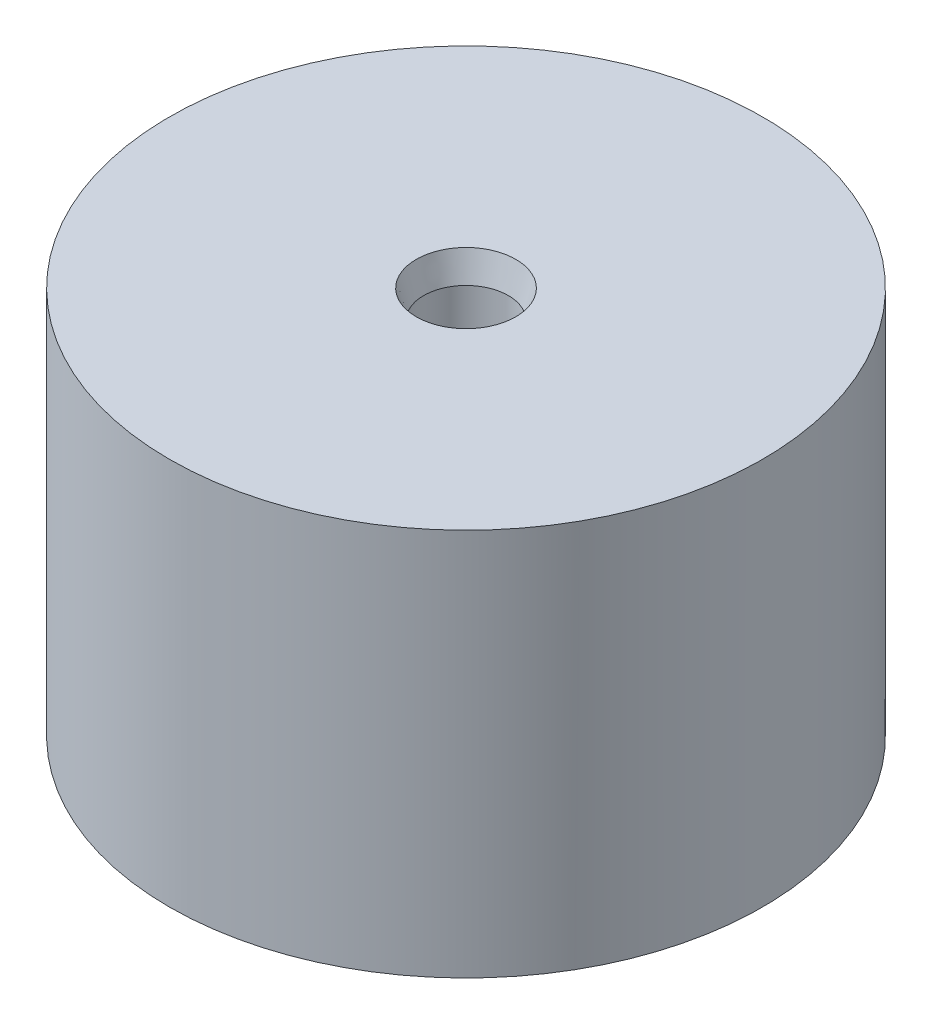
ISO-10303-21;
HEADER;
FILE_DESCRIPTION(('STEP AP214'),'2;1');
FILE_NAME('part.step','',(''),(''),'','','');
FILE_SCHEMA(('AUTOMOTIVE_DESIGN { 1 0 10303 214 1 1 1 1 }'));
ENDSEC;
DATA;
#1=APPLICATION_CONTEXT('core data for automotive mechanical design processes');
#2=APPLICATION_PROTOCOL_DEFINITION('international standard','automotive_design',2000,#1);
#3=PRODUCT_CONTEXT('',#1,'mechanical');
#4=PRODUCT('Part','Part','',(#3));
#5=PRODUCT_RELATED_PRODUCT_CATEGORY('part','',(#4));
#6=PRODUCT_DEFINITION_FORMATION('','',#4);
#7=PRODUCT_DEFINITION_CONTEXT('part definition',#1,'design');
#8=PRODUCT_DEFINITION('design','',#6,#7);
#9=PRODUCT_DEFINITION_SHAPE('','',#8);
#10=(LENGTH_UNIT() NAMED_UNIT(*) SI_UNIT(.MILLI.,.METRE.));
#11=(NAMED_UNIT(*) PLANE_ANGLE_UNIT() SI_UNIT($,.RADIAN.));
#12=(NAMED_UNIT(*) SI_UNIT($,.STERADIAN.) SOLID_ANGLE_UNIT());
#13=UNCERTAINTY_MEASURE_WITH_UNIT(LENGTH_MEASURE(1.E-05),#10,'distance_accuracy_value','');
#14=(GEOMETRIC_REPRESENTATION_CONTEXT(3) GLOBAL_UNCERTAINTY_ASSIGNED_CONTEXT((#13)) GLOBAL_UNIT_ASSIGNED_CONTEXT((#10,
#11,#12)) REPRESENTATION_CONTEXT('',''));
#15=CARTESIAN_POINT('',(0.,0.,0.));
#16=DIRECTION('',(0.,0.,1.));
#17=DIRECTION('',(1.,0.,0.));
#18=AXIS2_PLACEMENT_3D('',#15,#16,#17);
#19=CARTESIAN_POINT('',(0.,2.5,0.));
#20=DIRECTION('',(0.,1.,0.));
#21=DIRECTION('',(0.,0.,1.));
#22=AXIS2_PLACEMENT_3D('',#19,#20,#21);
#23=CONICAL_SURFACE('',#22,2.,0.261799387799143);
#24=CARTESIAN_POINT('',(0.,3.80621778264914,0.));
#25=DIRECTION('',(0.,1.,0.));
#26=DIRECTION('',(0.,0.,1.));
#27=AXIS2_PLACEMENT_3D('',#24,#25,#26);
#28=CIRCLE('',#27,2.35);
#29=CARTESIAN_POINT('',(0.,3.80621778264914,2.35));
#30=VERTEX_POINT('',#29);
#31=EDGE_CURVE('E10',#30,#30,#28,.T.);
#32=ORIENTED_EDGE('',*,*,#31,.T.);
#33=EDGE_LOOP('',(#32));
#34=FACE_BOUND('',#33,.T.);
#35=CARTESIAN_POINT('',(0.,2.5,0.));
#36=DIRECTION('',(0.,1.,0.));
#37=DIRECTION('',(0.,0.,1.));
#38=AXIS2_PLACEMENT_3D('',#35,#36,#37);
#39=CIRCLE('',#38,2.);
#40=CARTESIAN_POINT('',(0.,2.5,2.));
#41=VERTEX_POINT('',#40);
#42=EDGE_CURVE('E49',#41,#41,#39,.T.);
#43=ORIENTED_EDGE('',*,*,#42,.F.);
#44=EDGE_LOOP('',(#43));
#45=FACE_BOUND('',#44,.T.);
#46=ADVANCED_FACE('F30',(#34,#45),#23,.F.);
#47=CARTESIAN_POINT('',(-2.35,3.80621778264914,0.));
#48=DIRECTION('',(0.,1.,0.));
#49=DIRECTION('',(0.,0.,1.));
#50=AXIS2_PLACEMENT_3D('',#47,#48,#49);
#51=PLANE('',#50);
#52=CARTESIAN_POINT('',(0.,3.80621778264914,0.));
#53=DIRECTION('',(0.,1.,0.));
#54=DIRECTION('',(0.,0.,1.));
#55=AXIS2_PLACEMENT_3D('',#52,#53,#54);
#56=CIRCLE('',#55,14.);
#57=CARTESIAN_POINT('',(0.,3.80621778264914,14.));
#58=VERTEX_POINT('',#57);
#59=EDGE_CURVE('E36',#58,#58,#56,.T.);
#60=ORIENTED_EDGE('',*,*,#59,.T.);
#61=EDGE_LOOP('',(#60));
#62=FACE_BOUND('',#61,.T.);
#63=ORIENTED_EDGE('',*,*,#31,.F.);
#64=EDGE_LOOP('',(#63));
#65=FACE_BOUND('',#64,.T.);
#66=ADVANCED_FACE('F57',(#62,#65),#51,.T.);
#67=CARTESIAN_POINT('',(0.,20.798274686081,0.));
#68=DIRECTION('',(0.,1.,0.));
#69=DIRECTION('',(0.,0.,1.));
#70=AXIS2_PLACEMENT_3D('',#67,#68,#69);
#71=CYLINDRICAL_SURFACE('',#70,14.);
#72=CARTESIAN_POINT('',(0.,-14.5,0.));
#73=DIRECTION('',(0.,1.,0.));
#74=DIRECTION('',(0.,0.,1.));
#75=AXIS2_PLACEMENT_3D('',#72,#73,#74);
#76=CIRCLE('',#75,14.);
#77=CARTESIAN_POINT('',(0.,-14.5,-14.));
#78=VERTEX_POINT('',#77);
#79=EDGE_CURVE('E40',#78,#78,#76,.T.);
#80=ORIENTED_EDGE('',*,*,#79,.T.);
#81=EDGE_LOOP('',(#80));
#82=FACE_BOUND('',#81,.T.);
#83=ORIENTED_EDGE('',*,*,#59,.F.);
#84=EDGE_LOOP('',(#83));
#85=FACE_BOUND('',#84,.T.);
#86=ADVANCED_FACE('F61',(#82,#85),#71,.T.);
#87=CARTESIAN_POINT('',(0.,-14.5,0.));
#88=DIRECTION('',(0.,-1.,0.));
#89=DIRECTION('',(0.,0.,-1.));
#90=AXIS2_PLACEMENT_3D('',#87,#88,#89);
#91=CONICAL_SURFACE('',#90,14.,0.78539816339745);
#92=CARTESIAN_POINT('',(0.,-2.5,0.));
#93=DIRECTION('',(0.,1.,0.));
#94=DIRECTION('',(0.,0.,1.));
#95=AXIS2_PLACEMENT_3D('',#92,#93,#94);
#96=CIRCLE('',#95,2.);
#97=CARTESIAN_POINT('',(0.,-2.5,-1.99999999999999));
#98=VERTEX_POINT('',#97);
#99=EDGE_CURVE('E44',#98,#98,#96,.T.);
#100=CARTESIAN_POINT('',(0.,-2.5,-1.99999999999999));
#101=CARTESIAN_POINT('',(0.,-2.625,-2.125));
#102=CARTESIAN_POINT('',(0.,-2.75,-2.25));
#103=CARTESIAN_POINT('',(0.,-3.,-2.49999999999999));
#104=CARTESIAN_POINT('',(0.,-3.125,-2.62499999999999));
#105=CARTESIAN_POINT('',(0.,-3.375,-2.87499999999999));
#106=CARTESIAN_POINT('',(0.,-3.5,-3.));
#107=CARTESIAN_POINT('',(0.,-3.75,-3.25));
#108=CARTESIAN_POINT('',(0.,-3.875,-3.375));
#109=CARTESIAN_POINT('',(0.,-4.12499999999999,-3.625));
#110=CARTESIAN_POINT('',(0.,-4.24999999999999,-3.75));
#111=CARTESIAN_POINT('',(0.,-4.49999999999999,-3.99999999999999));
#112=CARTESIAN_POINT('',(0.,-4.62499999999999,-4.12499999999999));
#113=CARTESIAN_POINT('',(0.,-4.87499999999999,-4.375));
#114=CARTESIAN_POINT('',(0.,-4.99999999999999,-4.49999999999999));
#115=CARTESIAN_POINT('',(0.,-5.24999999999999,-4.74999999999999));
#116=CARTESIAN_POINT('',(0.,-5.37499999999999,-4.87499999999999));
#117=CARTESIAN_POINT('',(0.,-5.62499999999999,-5.12499999999999));
#118=CARTESIAN_POINT('',(0.,-5.74999999999999,-5.24999999999999));
#119=CARTESIAN_POINT('',(0.,-5.99999999999999,-5.49999999999999));
#120=CARTESIAN_POINT('',(0.,-6.12499999999999,-5.62499999999999));
#121=CARTESIAN_POINT('',(0.,-6.37499999999999,-5.87499999999999));
#122=CARTESIAN_POINT('',(0.,-6.49999999999999,-5.99999999999999));
#123=CARTESIAN_POINT('',(0.,-6.74999999999998,-6.24999999999999));
#124=CARTESIAN_POINT('',(0.,-6.87499999999998,-6.37499999999999));
#125=CARTESIAN_POINT('',(0.,-7.12499999999998,-6.62499999999999));
#126=CARTESIAN_POINT('',(0.,-7.24999999999998,-6.74999999999999));
#127=CARTESIAN_POINT('',(0.,-7.49999999999998,-6.99999999999999));
#128=CARTESIAN_POINT('',(0.,-7.62499999999998,-7.12499999999999));
#129=CARTESIAN_POINT('',(0.,-7.87499999999998,-7.37499999999999));
#130=CARTESIAN_POINT('',(0.,-7.99999999999998,-7.49999999999999));
#131=CARTESIAN_POINT('',(0.,-8.24999999999998,-7.74999999999999));
#132=CARTESIAN_POINT('',(0.,-8.37499999999998,-7.87499999999999));
#133=CARTESIAN_POINT('',(0.,-8.62499999999998,-8.12499999999999));
#134=CARTESIAN_POINT('',(0.,-8.74999999999998,-8.24999999999999));
#135=CARTESIAN_POINT('',(0.,-8.99999999999998,-8.49999999999999));
#136=CARTESIAN_POINT('',(0.,-9.12499999999998,-8.62499999999999));
#137=CARTESIAN_POINT('',(0.,-9.37499999999998,-8.87499999999999));
#138=CARTESIAN_POINT('',(0.,-9.49999999999998,-8.99999999999999));
#139=CARTESIAN_POINT('',(0.,-9.74999999999998,-9.24999999999999));
#140=CARTESIAN_POINT('',(0.,-9.87499999999998,-9.37499999999999));
#141=CARTESIAN_POINT('',(0.,-10.125,-9.62499999999999));
#142=CARTESIAN_POINT('',(0.,-10.25,-9.74999999999999));
#143=CARTESIAN_POINT('',(0.,-10.5,-9.99999999999999));
#144=CARTESIAN_POINT('',(0.,-10.625,-10.125));
#145=CARTESIAN_POINT('',(0.,-10.875,-10.375));
#146=CARTESIAN_POINT('',(0.,-11.,-10.5));
#147=CARTESIAN_POINT('',(0.,-11.25,-10.75));
#148=CARTESIAN_POINT('',(0.,-11.375,-10.875));
#149=CARTESIAN_POINT('',(0.,-11.625,-11.125));
#150=CARTESIAN_POINT('',(0.,-11.75,-11.25));
#151=CARTESIAN_POINT('',(0.,-12.,-11.5));
#152=CARTESIAN_POINT('',(0.,-12.125,-11.625));
#153=CARTESIAN_POINT('',(0.,-12.375,-11.875));
#154=CARTESIAN_POINT('',(0.,-12.5,-12.));
#155=CARTESIAN_POINT('',(0.,-12.75,-12.25));
#156=CARTESIAN_POINT('',(0.,-12.875,-12.375));
#157=CARTESIAN_POINT('',(0.,-13.125,-12.625));
#158=CARTESIAN_POINT('',(0.,-13.25,-12.75));
#159=CARTESIAN_POINT('',(0.,-13.5,-13.));
#160=CARTESIAN_POINT('',(0.,-13.625,-13.125));
#161=CARTESIAN_POINT('',(0.,-13.875,-13.375));
#162=CARTESIAN_POINT('',(0.,-14.,-13.5));
#163=CARTESIAN_POINT('',(0.,-14.25,-13.75));
#164=CARTESIAN_POINT('',(0.,-14.375,-13.875));
#165=CARTESIAN_POINT('',(0.,-14.5,-14.));
#166=B_SPLINE_CURVE_WITH_KNOTS('',3,(#100,#101,#102,#103,#104,#105,#106,#107,#108,#109,#110,
#111,#112,#113,#114,#115,#116,#117,#118,#119,#120,#121,#122,#123,#124,#125,#126,#127,#128,#129,
#130,#131,#132,#133,#134,#135,#136,#137,#138,#139,#140,#141,#142,#143,#144,#145,#146,#147,#148,
#149,#150,#151,#152,#153,#154,#155,#156,#157,#158,#159,#160,#161,#162,#163,#164,#165),
.UNSPECIFIED.,.F.,.F.,(4,2,2,2,2,2,2,2,2,2,2,2,2,2,2,2,2,2,2,2,2,2,2,2,2,2,2,2,2,2,2,2,4),(0.,
0.53033008588991,1.06066017177982,1.59099025766973,2.12132034355964,2.65165042944955,
3.18198051533946,3.71231060122937,4.24264068711928,4.77297077300919,5.3033008588991,
5.833630944789,6.36396103067892,6.89429111656883,7.42462120245874,7.95495128834865,
8.48528137423855,9.01561146012846,9.54594154601837,10.0762716319083,10.6066017177982,
11.1369318036881,11.667261889578,12.1975919754679,12.7279220613578,13.2582521472477,
13.7885822331377,14.3189123190276,14.8492424049175,15.3795724908074,15.9099025766973,
16.4402326625872,16.9705627484771),.UNSPECIFIED.);
#167=EDGE_CURVE('BSEAM65',#98,#78,#166,.T.);
#168=ORIENTED_EDGE('',*,*,#99,.T.);
#169=ORIENTED_EDGE('',*,*,#79,.F.);
#170=ORIENTED_EDGE('',*,*,#167,.T.);
#171=ORIENTED_EDGE('',*,*,#167,.F.);
#172=EDGE_LOOP('',(#168,#170,#169,#171));
#173=FACE_BOUND('',#172,.T.);
#174=ADVANCED_FACE('F65',(#173),#91,.F.);
#175=CARTESIAN_POINT('',(0.,20.798274686081,0.));
#176=DIRECTION('',(0.,1.,0.));
#177=DIRECTION('',(0.,0.,1.));
#178=AXIS2_PLACEMENT_3D('',#175,#176,#177);
#179=CYLINDRICAL_SURFACE('',#178,2.);
#180=ORIENTED_EDGE('',*,*,#42,.T.);
#181=EDGE_LOOP('',(#180));
#182=FACE_BOUND('',#181,.T.);
#183=ORIENTED_EDGE('',*,*,#99,.F.);
#184=EDGE_LOOP('',(#183));
#185=FACE_BOUND('',#184,.T.);
#186=ADVANCED_FACE('F53',(#182,#185),#179,.F.);
#187=CLOSED_SHELL('',(#46,#66,#86,#174,#186));
#188=MANIFOLD_SOLID_BREP('B2',#187);
#189=ADVANCED_BREP_SHAPE_REPRESENTATION('',(#18,#188),#14);
#190=SHAPE_DEFINITION_REPRESENTATION(#9,#189);
ENDSEC;
END-ISO-10303-21;
